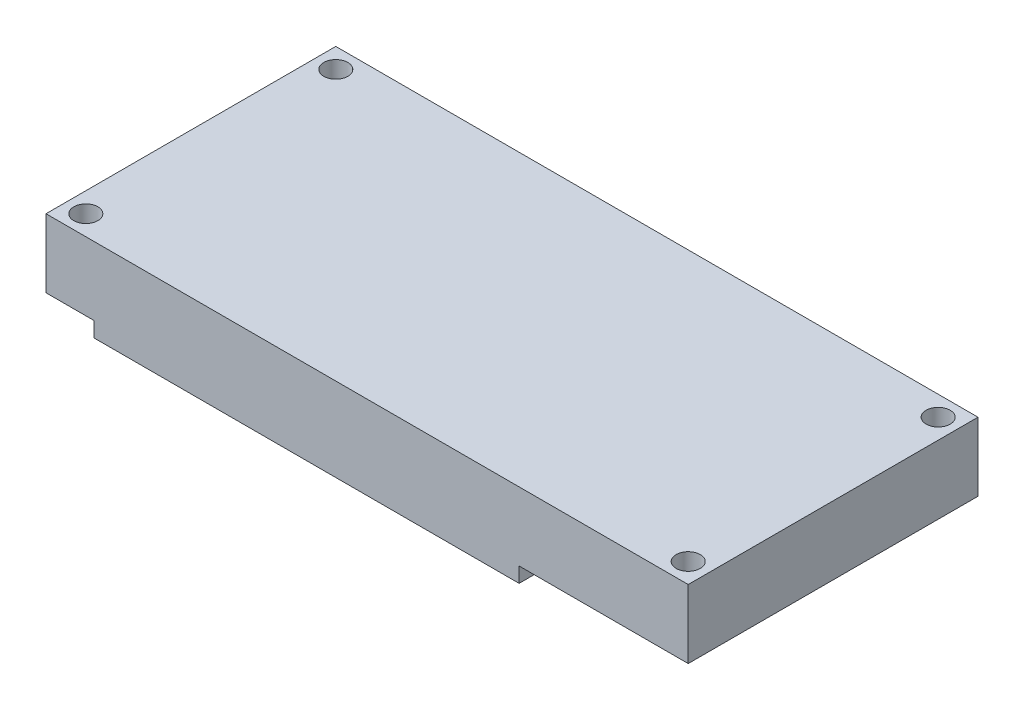
ISO-10303-21;
HEADER;
FILE_DESCRIPTION(('STEP AP214'),'2;1');
FILE_NAME('part.step','',(''),(''),'','','');
FILE_SCHEMA(('AUTOMOTIVE_DESIGN { 1 0 10303 214 1 1 1 1 }'));
ENDSEC;
DATA;
#1=APPLICATION_CONTEXT('core data for automotive mechanical design processes');
#2=APPLICATION_PROTOCOL_DEFINITION('international standard','automotive_design',2000,#1);
#3=PRODUCT_CONTEXT('',#1,'mechanical');
#4=PRODUCT('Part','Part','',(#3));
#5=PRODUCT_RELATED_PRODUCT_CATEGORY('part','',(#4));
#6=PRODUCT_DEFINITION_FORMATION('','',#4);
#7=PRODUCT_DEFINITION_CONTEXT('part definition',#1,'design');
#8=PRODUCT_DEFINITION('design','',#6,#7);
#9=PRODUCT_DEFINITION_SHAPE('','',#8);
#10=(LENGTH_UNIT() NAMED_UNIT(*) SI_UNIT(.MILLI.,.METRE.));
#11=(NAMED_UNIT(*) PLANE_ANGLE_UNIT() SI_UNIT($,.RADIAN.));
#12=(NAMED_UNIT(*) SI_UNIT($,.STERADIAN.) SOLID_ANGLE_UNIT());
#13=UNCERTAINTY_MEASURE_WITH_UNIT(LENGTH_MEASURE(1.E-05),#10,'distance_accuracy_value','');
#14=(GEOMETRIC_REPRESENTATION_CONTEXT(3) GLOBAL_UNCERTAINTY_ASSIGNED_CONTEXT((#13)) GLOBAL_UNIT_ASSIGNED_CONTEXT((#10,
#11,#12)) REPRESENTATION_CONTEXT('',''));
#15=CARTESIAN_POINT('',(0.,0.,0.));
#16=DIRECTION('',(0.,0.,1.));
#17=DIRECTION('',(1.,0.,0.));
#18=AXIS2_PLACEMENT_3D('',#15,#16,#17);
#19=CARTESIAN_POINT('',(0.,0.,0.));
#20=DIRECTION('',(0.,-1.,0.));
#21=DIRECTION('',(0.,0.,-1.));
#22=AXIS2_PLACEMENT_3D('',#19,#20,#21);
#23=PLANE('',#22);
#24=DIRECTION('',(0.,0.,-1.));
#25=VECTOR('',#24,1.);
#26=CARTESIAN_POINT('',(-33.99,0.,18.045));
#27=LINE('',#26,#25);
#28=CARTESIAN_POINT('',(-33.99,0.,18.045));
#29=VERTEX_POINT('',#28);
#30=CARTESIAN_POINT('',(-33.99,0.,-18.045));
#31=VERTEX_POINT('',#30);
#32=EDGE_CURVE('E119',#29,#31,#27,.T.);
#33=ORIENTED_EDGE('',*,*,#32,.F.);
#34=DIRECTION('',(1.,0.,0.));
#35=VECTOR('',#34,1.);
#36=CARTESIAN_POINT('',(-39.99,0.,18.045));
#37=LINE('',#36,#35);
#38=CARTESIAN_POINT('',(-39.99,0.,18.045));
#39=VERTEX_POINT('',#38);
#40=EDGE_CURVE('E154',#39,#29,#37,.T.);
#41=ORIENTED_EDGE('',*,*,#40,.F.);
#42=DIRECTION('',(0.,0.,1.));
#43=VECTOR('',#42,1.);
#44=CARTESIAN_POINT('',(-39.99,0.,18.045));
#45=LINE('',#44,#43);
#46=CARTESIAN_POINT('',(-39.99,0.,-18.045));
#47=VERTEX_POINT('',#46);
#48=EDGE_CURVE('E165',#47,#39,#45,.T.);
#49=ORIENTED_EDGE('',*,*,#48,.F.);
#50=DIRECTION('',(-1.,0.,0.));
#51=VECTOR('',#50,1.);
#52=CARTESIAN_POINT('',(-39.99,0.,-18.045));
#53=LINE('',#52,#51);
#54=EDGE_CURVE('E48',#31,#47,#53,.T.);
#55=ORIENTED_EDGE('',*,*,#54,.F.);
#56=EDGE_LOOP('',(#33,#41,#49,#55));
#57=FACE_BOUND('',#56,.T.);
#58=CARTESIAN_POINT('',(-37.51,0.,15.565));
#59=DIRECTION('',(0.,1.,0.));
#60=DIRECTION('',(0.,0.,-1.));
#61=AXIS2_PLACEMENT_3D('',#58,#59,#60);
#62=CIRCLE('',#61,1.5);
#63=CARTESIAN_POINT('',(-37.51,0.,14.065));
#64=VERTEX_POINT('',#63);
#65=EDGE_CURVE('E120',#64,#64,#62,.T.);
#66=ORIENTED_EDGE('',*,*,#65,.T.);
#67=EDGE_LOOP('',(#66));
#68=FACE_BOUND('',#67,.T.);
#69=CARTESIAN_POINT('',(-37.51,0.,-15.565));
#70=DIRECTION('',(0.,1.,0.));
#71=DIRECTION('',(0.,0.,1.));
#72=AXIS2_PLACEMENT_3D('',#69,#70,#71);
#73=CIRCLE('',#72,1.5);
#74=CARTESIAN_POINT('',(-37.51,0.,-14.065));
#75=VERTEX_POINT('',#74);
#76=EDGE_CURVE('E141',#75,#75,#73,.T.);
#77=ORIENTED_EDGE('',*,*,#76,.T.);
#78=EDGE_LOOP('',(#77));
#79=FACE_BOUND('',#78,.T.);
#80=ADVANCED_FACE('F33',(#57,#68,#79),#23,.T.);
#81=CARTESIAN_POINT('',(0.,8.53,0.));
#82=DIRECTION('',(0.,-1.,0.));
#83=DIRECTION('',(0.,0.,-1.));
#84=AXIS2_PLACEMENT_3D('',#81,#82,#83);
#85=PLANE('',#84);
#86=DIRECTION('',(0.,0.,-1.));
#87=VECTOR('',#86,1.);
#88=CARTESIAN_POINT('',(39.99,8.53,18.045));
#89=LINE('',#88,#87);
#90=CARTESIAN_POINT('',(39.99,8.53,18.045));
#91=VERTEX_POINT('',#90);
#92=CARTESIAN_POINT('',(39.99,8.53,-18.045));
#93=VERTEX_POINT('',#92);
#94=EDGE_CURVE('E150',#91,#93,#89,.T.);
#95=ORIENTED_EDGE('',*,*,#94,.T.);
#96=DIRECTION('',(-1.,0.,0.));
#97=VECTOR('',#96,1.);
#98=CARTESIAN_POINT('',(-39.99,8.53,-18.045));
#99=LINE('',#98,#97);
#100=CARTESIAN_POINT('',(-39.99,8.53,-18.045));
#101=VERTEX_POINT('',#100);
#102=EDGE_CURVE('E153',#93,#101,#99,.T.);
#103=ORIENTED_EDGE('',*,*,#102,.T.);
#104=DIRECTION('',(0.,0.,1.));
#105=VECTOR('',#104,1.);
#106=CARTESIAN_POINT('',(-39.99,8.53,18.045));
#107=LINE('',#106,#105);
#108=CARTESIAN_POINT('',(-39.99,8.53,18.045));
#109=VERTEX_POINT('',#108);
#110=EDGE_CURVE('E156',#101,#109,#107,.T.);
#111=ORIENTED_EDGE('',*,*,#110,.T.);
#112=DIRECTION('',(1.,0.,0.));
#113=VECTOR('',#112,1.);
#114=CARTESIAN_POINT('',(-39.99,8.53,18.045));
#115=LINE('',#114,#113);
#116=EDGE_CURVE('E158',#109,#91,#115,.T.);
#117=ORIENTED_EDGE('',*,*,#116,.T.);
#118=EDGE_LOOP('',(#95,#103,#111,#117));
#119=FACE_BOUND('',#118,.T.);
#120=CARTESIAN_POINT('',(-37.51,8.53,-15.565));
#121=DIRECTION('',(0.,1.,0.));
#122=DIRECTION('',(0.,0.,1.));
#123=AXIS2_PLACEMENT_3D('',#120,#121,#122);
#124=CIRCLE('',#123,1.5);
#125=CARTESIAN_POINT('',(-37.51,8.53,-14.065));
#126=VERTEX_POINT('',#125);
#127=EDGE_CURVE('E144',#126,#126,#124,.T.);
#128=ORIENTED_EDGE('',*,*,#127,.F.);
#129=EDGE_LOOP('',(#128));
#130=FACE_BOUND('',#129,.T.);
#131=CARTESIAN_POINT('',(37.51,8.53,-15.565));
#132=DIRECTION('',(0.,1.,0.));
#133=DIRECTION('',(0.,0.,-1.));
#134=AXIS2_PLACEMENT_3D('',#131,#132,#133);
#135=CIRCLE('',#134,1.5);
#136=CARTESIAN_POINT('',(37.51,8.53,-17.065));
#137=VERTEX_POINT('',#136);
#138=EDGE_CURVE('E138',#137,#137,#135,.T.);
#139=ORIENTED_EDGE('',*,*,#138,.F.);
#140=EDGE_LOOP('',(#139));
#141=FACE_BOUND('',#140,.T.);
#142=CARTESIAN_POINT('',(37.51,8.53,15.565));
#143=DIRECTION('',(0.,1.,0.));
#144=DIRECTION('',(0.,0.,1.));
#145=AXIS2_PLACEMENT_3D('',#142,#143,#144);
#146=CIRCLE('',#145,1.5);
#147=CARTESIAN_POINT('',(37.51,8.53,17.065));
#148=VERTEX_POINT('',#147);
#149=EDGE_CURVE('E132',#148,#148,#146,.T.);
#150=ORIENTED_EDGE('',*,*,#149,.F.);
#151=EDGE_LOOP('',(#150));
#152=FACE_BOUND('',#151,.T.);
#153=CARTESIAN_POINT('',(-37.51,8.53,15.565));
#154=DIRECTION('',(0.,1.,0.));
#155=DIRECTION('',(0.,0.,-1.));
#156=AXIS2_PLACEMENT_3D('',#153,#154,#155);
#157=CIRCLE('',#156,1.5);
#158=CARTESIAN_POINT('',(-37.51,8.53,14.065));
#159=VERTEX_POINT('',#158);
#160=EDGE_CURVE('E123',#159,#159,#157,.T.);
#161=ORIENTED_EDGE('',*,*,#160,.F.);
#162=EDGE_LOOP('',(#161));
#163=FACE_BOUND('',#162,.T.);
#164=ADVANCED_FACE('F203',(#119,#130,#141,#152,#163),#85,.F.);
#165=DIRECTION('',(0.,0.,1.));
#166=VECTOR('',#165,1.);
#167=CARTESIAN_POINT('',(18.93,0.,18.045));
#168=LINE('',#167,#166);
#169=CARTESIAN_POINT('',(18.93,0.,-18.045));
#170=VERTEX_POINT('',#169);
#171=CARTESIAN_POINT('',(18.93,0.,18.045));
#172=VERTEX_POINT('',#171);
#173=EDGE_CURVE('E56',#170,#172,#168,.T.);
#174=ORIENTED_EDGE('',*,*,#173,.F.);
#175=CARTESIAN_POINT('',(39.99,0.,-18.045));
#176=VERTEX_POINT('',#175);
#177=EDGE_CURVE('E163',#176,#170,#53,.T.);
#178=ORIENTED_EDGE('',*,*,#177,.F.);
#179=DIRECTION('',(0.,0.,-1.));
#180=VECTOR('',#179,1.);
#181=CARTESIAN_POINT('',(39.99,0.,18.045));
#182=LINE('',#181,#180);
#183=CARTESIAN_POINT('',(39.99,0.,18.045));
#184=VERTEX_POINT('',#183);
#185=EDGE_CURVE('E147',#184,#176,#182,.T.);
#186=ORIENTED_EDGE('',*,*,#185,.F.);
#187=EDGE_CURVE('E167',#172,#184,#37,.T.);
#188=ORIENTED_EDGE('',*,*,#187,.F.);
#189=EDGE_LOOP('',(#174,#178,#186,#188));
#190=FACE_BOUND('',#189,.T.);
#191=CARTESIAN_POINT('',(37.51,0.,15.565));
#192=DIRECTION('',(0.,1.,0.));
#193=DIRECTION('',(0.,0.,1.));
#194=AXIS2_PLACEMENT_3D('',#191,#192,#193);
#195=CIRCLE('',#194,1.5);
#196=CARTESIAN_POINT('',(37.51,0.,17.065));
#197=VERTEX_POINT('',#196);
#198=EDGE_CURVE('E130',#197,#197,#195,.T.);
#199=ORIENTED_EDGE('',*,*,#198,.T.);
#200=EDGE_LOOP('',(#199));
#201=FACE_BOUND('',#200,.T.);
#202=CARTESIAN_POINT('',(37.51,0.,-15.565));
#203=DIRECTION('',(0.,1.,0.));
#204=DIRECTION('',(0.,0.,-1.));
#205=AXIS2_PLACEMENT_3D('',#202,#203,#204);
#206=CIRCLE('',#205,1.5);
#207=CARTESIAN_POINT('',(37.51,0.,-17.065));
#208=VERTEX_POINT('',#207);
#209=EDGE_CURVE('E135',#208,#208,#206,.T.);
#210=ORIENTED_EDGE('',*,*,#209,.T.);
#211=EDGE_LOOP('',(#210));
#212=FACE_BOUND('',#211,.T.);
#213=ADVANCED_FACE('F200',(#190,#201,#212),#23,.T.);
#214=CARTESIAN_POINT('',(39.99,8.53,18.045));
#215=DIRECTION('',(-1.,0.,0.));
#216=DIRECTION('',(0.,0.,1.));
#217=AXIS2_PLACEMENT_3D('',#214,#215,#216);
#218=PLANE('',#217);
#219=ORIENTED_EDGE('',*,*,#185,.T.);
#220=DIRECTION('',(0.,-1.,0.));
#221=VECTOR('',#220,1.);
#222=CARTESIAN_POINT('',(39.99,8.53,-18.045));
#223=LINE('',#222,#221);
#224=EDGE_CURVE('E11',#93,#176,#223,.T.);
#225=ORIENTED_EDGE('',*,*,#224,.F.);
#226=ORIENTED_EDGE('',*,*,#94,.F.);
#227=DIRECTION('',(0.,-1.,0.));
#228=VECTOR('',#227,1.);
#229=CARTESIAN_POINT('',(39.99,8.53,18.045));
#230=LINE('',#229,#228);
#231=EDGE_CURVE('E160',#91,#184,#230,.T.);
#232=ORIENTED_EDGE('',*,*,#231,.T.);
#233=EDGE_LOOP('',(#219,#225,#226,#232));
#234=FACE_BOUND('',#233,.T.);
#235=ADVANCED_FACE('F35',(#234),#218,.F.);
#236=CARTESIAN_POINT('',(-39.99,8.53,-18.045));
#237=DIRECTION('',(0.,0.,1.));
#238=DIRECTION('',(1.,0.,0.));
#239=AXIS2_PLACEMENT_3D('',#236,#237,#238);
#240=PLANE('',#239);
#241=ORIENTED_EDGE('',*,*,#177,.T.);
#242=DIRECTION('',(0.,1.,0.));
#243=VECTOR('',#242,1.);
#244=CARTESIAN_POINT('',(18.93,-1.88,-18.045));
#245=LINE('',#244,#243);
#246=CARTESIAN_POINT('',(18.93,-1.88,-18.045));
#247=VERTEX_POINT('',#246);
#248=EDGE_CURVE('E104',#247,#170,#245,.T.);
#249=ORIENTED_EDGE('',*,*,#248,.F.);
#250=DIRECTION('',(1.,0.,0.));
#251=VECTOR('',#250,1.);
#252=CARTESIAN_POINT('',(-33.99,-1.88,-18.045));
#253=LINE('',#252,#251);
#254=CARTESIAN_POINT('',(-33.99,-1.88,-18.045));
#255=VERTEX_POINT('',#254);
#256=EDGE_CURVE('E97',#255,#247,#253,.T.);
#257=ORIENTED_EDGE('',*,*,#256,.F.);
#258=DIRECTION('',(0.,1.,0.));
#259=VECTOR('',#258,1.);
#260=CARTESIAN_POINT('',(-33.99,-1.88,-18.045));
#261=LINE('',#260,#259);
#262=EDGE_CURVE('E101',#255,#31,#261,.T.);
#263=ORIENTED_EDGE('',*,*,#262,.T.);
#264=ORIENTED_EDGE('',*,*,#54,.T.);
#265=DIRECTION('',(0.,-1.,0.));
#266=VECTOR('',#265,1.);
#267=CARTESIAN_POINT('',(-39.99,8.53,-18.045));
#268=LINE('',#267,#266);
#269=EDGE_CURVE('E41',#101,#47,#268,.T.);
#270=ORIENTED_EDGE('',*,*,#269,.F.);
#271=ORIENTED_EDGE('',*,*,#102,.F.);
#272=ORIENTED_EDGE('',*,*,#224,.T.);
#273=EDGE_LOOP('',(#241,#249,#257,#263,#264,#270,#271,#272));
#274=FACE_BOUND('',#273,.T.);
#275=ADVANCED_FACE('F99',(#274),#240,.F.);
#276=CARTESIAN_POINT('',(-39.99,8.53,18.045));
#277=DIRECTION('',(1.,0.,0.));
#278=DIRECTION('',(0.,0.,-1.));
#279=AXIS2_PLACEMENT_3D('',#276,#277,#278);
#280=PLANE('',#279);
#281=ORIENTED_EDGE('',*,*,#48,.T.);
#282=DIRECTION('',(0.,-1.,0.));
#283=VECTOR('',#282,1.);
#284=CARTESIAN_POINT('',(-39.99,8.53,18.045));
#285=LINE('',#284,#283);
#286=EDGE_CURVE('E172',#109,#39,#285,.T.);
#287=ORIENTED_EDGE('',*,*,#286,.F.);
#288=ORIENTED_EDGE('',*,*,#110,.F.);
#289=ORIENTED_EDGE('',*,*,#269,.T.);
#290=EDGE_LOOP('',(#281,#287,#288,#289));
#291=FACE_BOUND('',#290,.T.);
#292=ADVANCED_FACE('F178',(#291),#280,.F.);
#293=CARTESIAN_POINT('',(-39.99,8.53,18.045));
#294=DIRECTION('',(0.,0.,-1.));
#295=DIRECTION('',(-1.,0.,0.));
#296=AXIS2_PLACEMENT_3D('',#293,#294,#295);
#297=PLANE('',#296);
#298=ORIENTED_EDGE('',*,*,#40,.T.);
#299=DIRECTION('',(0.,1.,0.));
#300=VECTOR('',#299,1.);
#301=CARTESIAN_POINT('',(-33.99,-1.88,18.045));
#302=LINE('',#301,#300);
#303=CARTESIAN_POINT('',(-33.99,-1.88,18.045));
#304=VERTEX_POINT('',#303);
#305=EDGE_CURVE('E184',#304,#29,#302,.T.);
#306=ORIENTED_EDGE('',*,*,#305,.F.);
#307=DIRECTION('',(-1.,0.,0.));
#308=VECTOR('',#307,1.);
#309=CARTESIAN_POINT('',(-33.99,-1.88,18.045));
#310=LINE('',#309,#308);
#311=CARTESIAN_POINT('',(18.93,-1.88,18.045));
#312=VERTEX_POINT('',#311);
#313=EDGE_CURVE('E113',#312,#304,#310,.T.);
#314=ORIENTED_EDGE('',*,*,#313,.F.);
#315=DIRECTION('',(0.,1.,0.));
#316=VECTOR('',#315,1.);
#317=CARTESIAN_POINT('',(18.93,-1.88,18.045));
#318=LINE('',#317,#316);
#319=EDGE_CURVE('E125',#312,#172,#318,.T.);
#320=ORIENTED_EDGE('',*,*,#319,.T.);
#321=ORIENTED_EDGE('',*,*,#187,.T.);
#322=ORIENTED_EDGE('',*,*,#231,.F.);
#323=ORIENTED_EDGE('',*,*,#116,.F.);
#324=ORIENTED_EDGE('',*,*,#286,.T.);
#325=EDGE_LOOP('',(#298,#306,#314,#320,#321,#322,#323,#324));
#326=FACE_BOUND('',#325,.T.);
#327=ADVANCED_FACE('F183',(#326),#297,.F.);
#328=CARTESIAN_POINT('',(-37.51,8.53,-15.565));
#329=DIRECTION('',(0.,-1.,0.));
#330=DIRECTION('',(0.,0.,-1.));
#331=AXIS2_PLACEMENT_3D('',#328,#329,#330);
#332=CYLINDRICAL_SURFACE('',#331,1.5);
#333=ORIENTED_EDGE('',*,*,#127,.T.);
#334=EDGE_LOOP('',(#333));
#335=FACE_BOUND('',#334,.T.);
#336=ORIENTED_EDGE('',*,*,#76,.F.);
#337=EDGE_LOOP('',(#336));
#338=FACE_BOUND('',#337,.T.);
#339=ADVANCED_FACE('F226',(#335,#338),#332,.F.);
#340=CARTESIAN_POINT('',(37.51,8.53,-15.565));
#341=DIRECTION('',(0.,-1.,0.));
#342=DIRECTION('',(0.,0.,-1.));
#343=AXIS2_PLACEMENT_3D('',#340,#341,#342);
#344=CYLINDRICAL_SURFACE('',#343,1.5);
#345=ORIENTED_EDGE('',*,*,#138,.T.);
#346=EDGE_LOOP('',(#345));
#347=FACE_BOUND('',#346,.T.);
#348=ORIENTED_EDGE('',*,*,#209,.F.);
#349=EDGE_LOOP('',(#348));
#350=FACE_BOUND('',#349,.T.);
#351=ADVANCED_FACE('F228',(#347,#350),#344,.F.);
#352=CARTESIAN_POINT('',(37.51,8.53,15.565));
#353=DIRECTION('',(0.,-1.,0.));
#354=DIRECTION('',(0.,0.,-1.));
#355=AXIS2_PLACEMENT_3D('',#352,#353,#354);
#356=CYLINDRICAL_SURFACE('',#355,1.5);
#357=ORIENTED_EDGE('',*,*,#149,.T.);
#358=EDGE_LOOP('',(#357));
#359=FACE_BOUND('',#358,.T.);
#360=ORIENTED_EDGE('',*,*,#198,.F.);
#361=EDGE_LOOP('',(#360));
#362=FACE_BOUND('',#361,.T.);
#363=ADVANCED_FACE('F218',(#359,#362),#356,.F.);
#364=CARTESIAN_POINT('',(-37.51,8.53,15.565));
#365=DIRECTION('',(0.,-1.,0.));
#366=DIRECTION('',(0.,0.,-1.));
#367=AXIS2_PLACEMENT_3D('',#364,#365,#366);
#368=CYLINDRICAL_SURFACE('',#367,1.5);
#369=ORIENTED_EDGE('',*,*,#160,.T.);
#370=EDGE_LOOP('',(#369));
#371=FACE_BOUND('',#370,.T.);
#372=ORIENTED_EDGE('',*,*,#65,.F.);
#373=EDGE_LOOP('',(#372));
#374=FACE_BOUND('',#373,.T.);
#375=ADVANCED_FACE('F215',(#371,#374),#368,.F.);
#376=CARTESIAN_POINT('',(-33.99,-1.88,18.045));
#377=DIRECTION('',(1.,0.,0.));
#378=DIRECTION('',(0.,0.,-1.));
#379=AXIS2_PLACEMENT_3D('',#376,#377,#378);
#380=PLANE('',#379);
#381=ORIENTED_EDGE('',*,*,#32,.T.);
#382=ORIENTED_EDGE('',*,*,#262,.F.);
#383=DIRECTION('',(0.,0.,-1.));
#384=VECTOR('',#383,1.);
#385=CARTESIAN_POINT('',(-33.99,-1.88,18.045));
#386=LINE('',#385,#384);
#387=EDGE_CURVE('E108',#304,#255,#386,.T.);
#388=ORIENTED_EDGE('',*,*,#387,.F.);
#389=ORIENTED_EDGE('',*,*,#305,.T.);
#390=EDGE_LOOP('',(#381,#382,#388,#389));
#391=FACE_BOUND('',#390,.T.);
#392=ADVANCED_FACE('F118',(#391),#380,.F.);
#393=CARTESIAN_POINT('',(18.93,-1.88,18.045));
#394=DIRECTION('',(-1.,0.,0.));
#395=DIRECTION('',(0.,0.,1.));
#396=AXIS2_PLACEMENT_3D('',#393,#394,#395);
#397=PLANE('',#396);
#398=ORIENTED_EDGE('',*,*,#173,.T.);
#399=ORIENTED_EDGE('',*,*,#319,.F.);
#400=DIRECTION('',(0.,0.,1.));
#401=VECTOR('',#400,1.);
#402=CARTESIAN_POINT('',(18.93,-1.88,18.045));
#403=LINE('',#402,#401);
#404=EDGE_CURVE('E107',#247,#312,#403,.T.);
#405=ORIENTED_EDGE('',*,*,#404,.F.);
#406=ORIENTED_EDGE('',*,*,#248,.T.);
#407=EDGE_LOOP('',(#398,#399,#405,#406));
#408=FACE_BOUND('',#407,.T.);
#409=ADVANCED_FACE('F194',(#408),#397,.F.);
#410=CARTESIAN_POINT('',(0.,-1.88,0.));
#411=DIRECTION('',(0.,-1.,0.));
#412=DIRECTION('',(0.,0.,-1.));
#413=AXIS2_PLACEMENT_3D('',#410,#411,#412);
#414=PLANE('',#413);
#415=ORIENTED_EDGE('',*,*,#387,.T.);
#416=ORIENTED_EDGE('',*,*,#256,.T.);
#417=ORIENTED_EDGE('',*,*,#404,.T.);
#418=ORIENTED_EDGE('',*,*,#313,.T.);
#419=EDGE_LOOP('',(#415,#416,#417,#418));
#420=FACE_BOUND('',#419,.T.);
#421=ADVANCED_FACE('F111',(#420),#414,.T.);
#422=CLOSED_SHELL('',(#80,#164,#213,#235,#275,#292,#327,#339,#351,#363,#375,#392,#409,#421));
#423=MANIFOLD_SOLID_BREP('B2',#422);
#424=ADVANCED_BREP_SHAPE_REPRESENTATION('',(#18,#423),#14);
#425=SHAPE_DEFINITION_REPRESENTATION(#9,#424);
ENDSEC;
END-ISO-10303-21;
